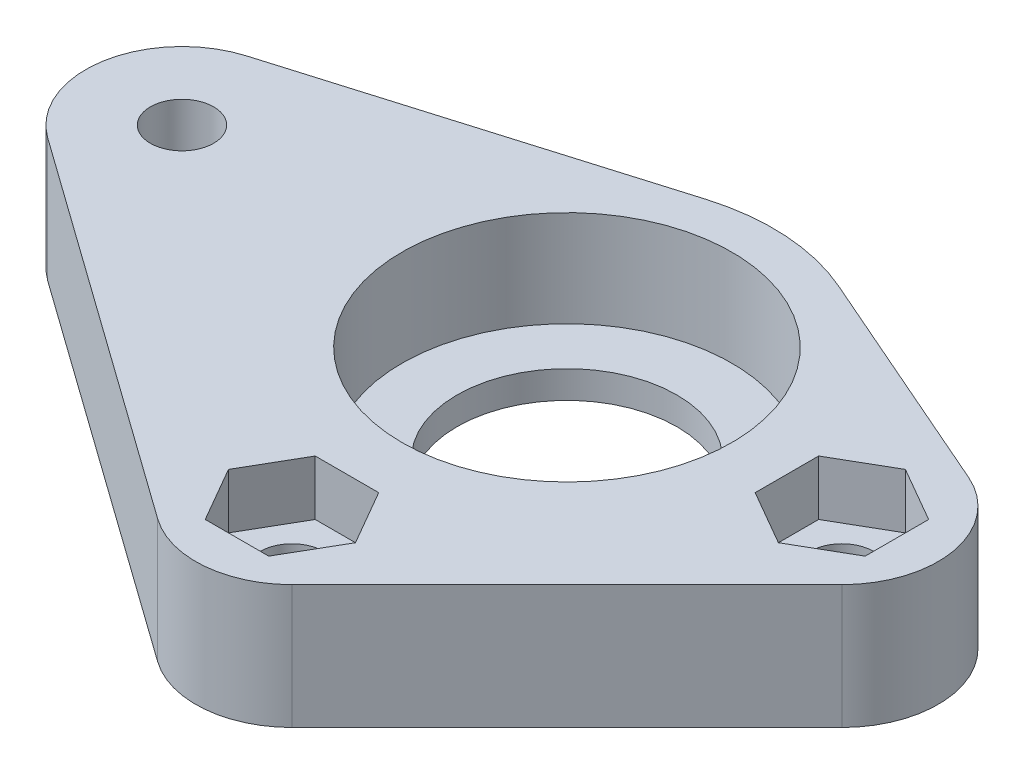
ISO-10303-21;
HEADER;
FILE_DESCRIPTION(('STEP AP214'),'2;1');
FILE_NAME('part.step','',(''),(''),'','','');
FILE_SCHEMA(('AUTOMOTIVE_DESIGN { 1 0 10303 214 1 1 1 1 }'));
ENDSEC;
DATA;
#1=APPLICATION_CONTEXT('core data for automotive mechanical design processes');
#2=APPLICATION_PROTOCOL_DEFINITION('international standard','automotive_design',2000,#1);
#3=PRODUCT_CONTEXT('',#1,'mechanical');
#4=PRODUCT('Part','Part','',(#3));
#5=PRODUCT_RELATED_PRODUCT_CATEGORY('part','',(#4));
#6=PRODUCT_DEFINITION_FORMATION('','',#4);
#7=PRODUCT_DEFINITION_CONTEXT('part definition',#1,'design');
#8=PRODUCT_DEFINITION('design','',#6,#7);
#9=PRODUCT_DEFINITION_SHAPE('','',#8);
#10=(LENGTH_UNIT() NAMED_UNIT(*) SI_UNIT(.MILLI.,.METRE.));
#11=(NAMED_UNIT(*) PLANE_ANGLE_UNIT() SI_UNIT($,.RADIAN.));
#12=(NAMED_UNIT(*) SI_UNIT($,.STERADIAN.) SOLID_ANGLE_UNIT());
#13=UNCERTAINTY_MEASURE_WITH_UNIT(LENGTH_MEASURE(1.E-05),#10,'distance_accuracy_value','');
#14=(GEOMETRIC_REPRESENTATION_CONTEXT(3) GLOBAL_UNCERTAINTY_ASSIGNED_CONTEXT((#13)) GLOBAL_UNIT_ASSIGNED_CONTEXT((#10,
#11,#12)) REPRESENTATION_CONTEXT('',''));
#15=CARTESIAN_POINT('',(0.,0.,0.));
#16=DIRECTION('',(0.,0.,1.));
#17=DIRECTION('',(1.,0.,0.));
#18=AXIS2_PLACEMENT_3D('',#15,#16,#17);
#19=CARTESIAN_POINT('',(-14.,4.5,0.));
#20=DIRECTION('',(0.,-1.,0.));
#21=DIRECTION('',(0.,0.,-1.));
#22=AXIS2_PLACEMENT_3D('',#19,#20,#21);
#23=CYLINDRICAL_SURFACE('',#22,1.15);
#24=CARTESIAN_POINT('',(-14.,4.5,0.));
#25=DIRECTION('',(0.,1.,0.));
#26=DIRECTION('',(0.,0.,1.));
#27=AXIS2_PLACEMENT_3D('',#24,#25,#26);
#28=CIRCLE('',#27,1.15);
#29=CARTESIAN_POINT('',(-14.,4.5,1.15));
#30=VERTEX_POINT('',#29);
#31=EDGE_CURVE('E372',#30,#30,#28,.T.);
#32=ORIENTED_EDGE('',*,*,#31,.T.);
#33=EDGE_LOOP('',(#32));
#34=FACE_BOUND('',#33,.T.);
#35=CARTESIAN_POINT('',(-14.,2.,0.));
#36=DIRECTION('',(0.,-1.,0.));
#37=DIRECTION('',(0.,0.,-1.));
#38=AXIS2_PLACEMENT_3D('',#35,#36,#37);
#39=CIRCLE('',#38,1.15);
#40=CARTESIAN_POINT('',(-14.,2.,-1.15));
#41=VERTEX_POINT('',#40);
#42=EDGE_CURVE('E38',#41,#41,#39,.T.);
#43=ORIENTED_EDGE('',*,*,#42,.T.);
#44=EDGE_LOOP('',(#43));
#45=FACE_BOUND('',#44,.T.);
#46=ADVANCED_FACE('F34',(#34,#45),#23,.F.);
#47=CARTESIAN_POINT('',(10.,4.5,0.));
#48=DIRECTION('',(0.,-1.,0.));
#49=DIRECTION('',(0.,0.,-1.));
#50=AXIS2_PLACEMENT_3D('',#47,#48,#49);
#51=CYLINDRICAL_SURFACE('',#50,1.15);
#52=CARTESIAN_POINT('',(10.,0.,0.));
#53=DIRECTION('',(0.,1.,0.));
#54=DIRECTION('',(0.,0.,1.));
#55=AXIS2_PLACEMENT_3D('',#52,#53,#54);
#56=CIRCLE('',#55,1.15);
#57=CARTESIAN_POINT('',(10.,0.,1.15));
#58=VERTEX_POINT('',#57);
#59=EDGE_CURVE('E369',#58,#58,#56,.T.);
#60=ORIENTED_EDGE('',*,*,#59,.F.);
#61=EDGE_LOOP('',(#60));
#62=FACE_BOUND('',#61,.T.);
#63=CARTESIAN_POINT('',(10.,2.5,0.));
#64=DIRECTION('',(0.,1.,0.));
#65=DIRECTION('',(0.,0.,1.));
#66=AXIS2_PLACEMENT_3D('',#63,#64,#65);
#67=CIRCLE('',#66,1.15);
#68=CARTESIAN_POINT('',(10.,2.5,1.15));
#69=VERTEX_POINT('',#68);
#70=EDGE_CURVE('E365',#69,#69,#67,.T.);
#71=ORIENTED_EDGE('',*,*,#70,.T.);
#72=EDGE_LOOP('',(#71));
#73=FACE_BOUND('',#72,.T.);
#74=ADVANCED_FACE('F438',(#62,#73),#51,.F.);
#75=CARTESIAN_POINT('',(0.,4.5,10.));
#76=DIRECTION('',(0.,-1.,0.));
#77=DIRECTION('',(0.,0.,-1.));
#78=AXIS2_PLACEMENT_3D('',#75,#76,#77);
#79=CYLINDRICAL_SURFACE('',#78,1.15);
#80=CARTESIAN_POINT('',(0.,0.,10.));
#81=DIRECTION('',(0.,1.,0.));
#82=DIRECTION('',(0.,0.,1.));
#83=AXIS2_PLACEMENT_3D('',#80,#81,#82);
#84=CIRCLE('',#83,1.15);
#85=CARTESIAN_POINT('',(0.,0.,11.15));
#86=VERTEX_POINT('',#85);
#87=EDGE_CURVE('E366',#86,#86,#84,.T.);
#88=ORIENTED_EDGE('',*,*,#87,.F.);
#89=EDGE_LOOP('',(#88));
#90=FACE_BOUND('',#89,.T.);
#91=CARTESIAN_POINT('',(0.,2.5,10.));
#92=DIRECTION('',(0.,1.,0.));
#93=DIRECTION('',(0.,0.,1.));
#94=AXIS2_PLACEMENT_3D('',#91,#92,#93);
#95=CIRCLE('',#94,1.15);
#96=CARTESIAN_POINT('',(0.,2.5,11.15));
#97=VERTEX_POINT('',#96);
#98=EDGE_CURVE('E301',#97,#97,#95,.T.);
#99=ORIENTED_EDGE('',*,*,#98,.T.);
#100=EDGE_LOOP('',(#99));
#101=FACE_BOUND('',#100,.T.);
#102=ADVANCED_FACE('F564',(#90,#101),#79,.F.);
#103=CARTESIAN_POINT('',(0.,4.5,0.));
#104=DIRECTION('',(0.,-1.,0.));
#105=DIRECTION('',(0.,0.,-1.));
#106=AXIS2_PLACEMENT_3D('',#103,#104,#105);
#107=CYLINDRICAL_SURFACE('',#106,4.);
#108=CARTESIAN_POINT('',(0.,0.,0.));
#109=DIRECTION('',(0.,1.,0.));
#110=DIRECTION('',(0.,0.,1.));
#111=AXIS2_PLACEMENT_3D('',#108,#109,#110);
#112=CIRCLE('',#111,4.);
#113=CARTESIAN_POINT('',(0.,0.,4.));
#114=VERTEX_POINT('',#113);
#115=EDGE_CURVE('E375',#114,#114,#112,.T.);
#116=ORIENTED_EDGE('',*,*,#115,.F.);
#117=EDGE_LOOP('',(#116));
#118=FACE_BOUND('',#117,.T.);
#119=CARTESIAN_POINT('',(0.,1.,0.));
#120=DIRECTION('',(0.,1.,0.));
#121=DIRECTION('',(0.,0.,1.));
#122=AXIS2_PLACEMENT_3D('',#119,#120,#121);
#123=CIRCLE('',#122,4.);
#124=CARTESIAN_POINT('',(0.,1.,4.));
#125=VERTEX_POINT('',#124);
#126=EDGE_CURVE('E361',#125,#125,#123,.T.);
#127=ORIENTED_EDGE('',*,*,#126,.T.);
#128=EDGE_LOOP('',(#127));
#129=FACE_BOUND('',#128,.T.);
#130=ADVANCED_FACE('F471',(#118,#129),#107,.F.);
#131=CARTESIAN_POINT('',(0.,4.5,0.));
#132=DIRECTION('',(0.,-1.,0.));
#133=DIRECTION('',(0.,0.,-1.));
#134=AXIS2_PLACEMENT_3D('',#131,#132,#133);
#135=PLANE('',#134);
#136=DIRECTION('',(0.,0.,-1.));
#137=VECTOR('',#136,1.);
#138=CARTESIAN_POINT('',(12.,4.5,1.15470053837925));
#139=LINE('',#138,#137);
#140=CARTESIAN_POINT('',(12.,4.5,1.15470053837925));
#141=VERTEX_POINT('',#140);
#142=CARTESIAN_POINT('',(12.,4.5,-1.15470053837925));
#143=VERTEX_POINT('',#142);
#144=EDGE_CURVE('E284',#141,#143,#139,.T.);
#145=ORIENTED_EDGE('',*,*,#144,.F.);
#146=DIRECTION('',(0.866025403784439,0.,-0.5));
#147=VECTOR('',#146,1.);
#148=CARTESIAN_POINT('',(10.,4.5,2.3094010767585));
#149=LINE('',#148,#147);
#150=CARTESIAN_POINT('',(10.,4.5,2.3094010767585));
#151=VERTEX_POINT('',#150);
#152=EDGE_CURVE('E59',#151,#141,#149,.T.);
#153=ORIENTED_EDGE('',*,*,#152,.F.);
#154=DIRECTION('',(0.866025403784438,0.,0.5));
#155=VECTOR('',#154,1.);
#156=CARTESIAN_POINT('',(8.,4.5,1.15470053837925));
#157=LINE('',#156,#155);
#158=CARTESIAN_POINT('',(8.,4.5,1.15470053837925));
#159=VERTEX_POINT('',#158);
#160=EDGE_CURVE('E267',#159,#151,#157,.T.);
#161=ORIENTED_EDGE('',*,*,#160,.F.);
#162=DIRECTION('',(0.,0.,1.));
#163=VECTOR('',#162,1.);
#164=CARTESIAN_POINT('',(8.,4.5,-1.15470053837925));
#165=LINE('',#164,#163);
#166=CARTESIAN_POINT('',(8.,4.5,-1.15470053837925));
#167=VERTEX_POINT('',#166);
#168=EDGE_CURVE('E294',#167,#159,#165,.T.);
#169=ORIENTED_EDGE('',*,*,#168,.F.);
#170=DIRECTION('',(-0.866025403784439,0.,0.5));
#171=VECTOR('',#170,1.);
#172=CARTESIAN_POINT('',(10.,4.5,-2.3094010767585));
#173=LINE('',#172,#171);
#174=CARTESIAN_POINT('',(10.,4.5,-2.3094010767585));
#175=VERTEX_POINT('',#174);
#176=EDGE_CURVE('E291',#175,#167,#173,.T.);
#177=ORIENTED_EDGE('',*,*,#176,.F.);
#178=DIRECTION('',(-0.866025403784439,0.,-0.5));
#179=VECTOR('',#178,1.);
#180=CARTESIAN_POINT('',(12.,4.5,-1.15470053837925));
#181=LINE('',#180,#179);
#182=EDGE_CURVE('E288',#143,#175,#181,.T.);
#183=ORIENTED_EDGE('',*,*,#182,.F.);
#184=EDGE_LOOP('',(#145,#153,#161,#169,#177,#183));
#185=FACE_BOUND('',#184,.T.);
#186=DIRECTION('',(-0.5,0.,-0.866025403784439));
#187=VECTOR('',#186,1.);
#188=CARTESIAN_POINT('',(2.3094010767585,4.5,10.));
#189=LINE('',#188,#187);
#190=CARTESIAN_POINT('',(2.3094010767585,4.5,10.));
#191=VERTEX_POINT('',#190);
#192=CARTESIAN_POINT('',(1.15470053837925,4.5,8.));
#193=VERTEX_POINT('',#192);
#194=EDGE_CURVE('E333',#191,#193,#189,.T.);
#195=ORIENTED_EDGE('',*,*,#194,.F.);
#196=DIRECTION('',(0.5,0.,-0.866025403784439));
#197=VECTOR('',#196,1.);
#198=CARTESIAN_POINT('',(1.15470053837925,4.5,12.));
#199=LINE('',#198,#197);
#200=CARTESIAN_POINT('',(1.15470053837925,4.5,12.));
#201=VERTEX_POINT('',#200);
#202=EDGE_CURVE('E331',#201,#191,#199,.T.);
#203=ORIENTED_EDGE('',*,*,#202,.F.);
#204=DIRECTION('',(1.,0.,0.));
#205=VECTOR('',#204,1.);
#206=CARTESIAN_POINT('',(-1.15470053837925,4.5,12.));
#207=LINE('',#206,#205);
#208=CARTESIAN_POINT('',(-1.15470053837925,4.5,12.));
#209=VERTEX_POINT('',#208);
#210=EDGE_CURVE('E315',#209,#201,#207,.T.);
#211=ORIENTED_EDGE('',*,*,#210,.F.);
#212=DIRECTION('',(0.5,0.,0.866025403784439));
#213=VECTOR('',#212,1.);
#214=CARTESIAN_POINT('',(-2.30940107675851,4.5,10.));
#215=LINE('',#214,#213);
#216=CARTESIAN_POINT('',(-2.30940107675851,4.5,10.));
#217=VERTEX_POINT('',#216);
#218=EDGE_CURVE('E342',#217,#209,#215,.T.);
#219=ORIENTED_EDGE('',*,*,#218,.F.);
#220=DIRECTION('',(-0.5,0.,0.866025403784439));
#221=VECTOR('',#220,1.);
#222=CARTESIAN_POINT('',(-1.15470053837925,4.5,8.));
#223=LINE('',#222,#221);
#224=CARTESIAN_POINT('',(-1.15470053837925,4.5,8.));
#225=VERTEX_POINT('',#224);
#226=EDGE_CURVE('E339',#225,#217,#223,.T.);
#227=ORIENTED_EDGE('',*,*,#226,.F.);
#228=DIRECTION('',(-1.,0.,0.));
#229=VECTOR('',#228,1.);
#230=CARTESIAN_POINT('',(1.15470053837925,4.5,8.));
#231=LINE('',#230,#229);
#232=EDGE_CURVE('E336',#193,#225,#231,.T.);
#233=ORIENTED_EDGE('',*,*,#232,.F.);
#234=EDGE_LOOP('',(#195,#203,#211,#219,#227,#233));
#235=FACE_BOUND('',#234,.T.);
#236=CARTESIAN_POINT('',(0.,4.5,0.));
#237=DIRECTION('',(0.,1.,0.));
#238=DIRECTION('',(0.,0.,1.));
#239=AXIS2_PLACEMENT_3D('',#236,#237,#238);
#240=CIRCLE('',#239,6.);
#241=CARTESIAN_POINT('',(0.,4.5,6.));
#242=VERTEX_POINT('',#241);
#243=EDGE_CURVE('E362',#242,#242,#240,.T.);
#244=ORIENTED_EDGE('',*,*,#243,.F.);
#245=EDGE_LOOP('',(#244));
#246=FACE_BOUND('',#245,.T.);
#247=CARTESIAN_POINT('',(0.,4.5,0.));
#248=DIRECTION('',(0.,1.,0.));
#249=DIRECTION('',(0.,0.,-1.));
#250=AXIS2_PLACEMENT_3D('',#247,#248,#249);
#251=CIRCLE('',#250,7.5);
#252=CARTESIAN_POINT('',(3.,4.5,-6.87386354243376));
#253=VERTEX_POINT('',#252);
#254=CARTESIAN_POINT('',(-2.14285714285714,4.5,-7.18736135624932));
#255=VERTEX_POINT('',#254);
#256=EDGE_CURVE('E379',#253,#255,#251,.T.);
#257=ORIENTED_EDGE('',*,*,#256,.T.);
#258=DIRECTION('',(-0.95831484749991,0.,0.285714285714286));
#259=VECTOR('',#258,1.);
#260=CARTESIAN_POINT('',(-15.,4.5,-3.35410196624968));
#261=LINE('',#260,#259);
#262=CARTESIAN_POINT('',(-15.,4.5,-3.35410196624969));
#263=VERTEX_POINT('',#262);
#264=EDGE_CURVE('E382',#255,#263,#261,.T.);
#265=ORIENTED_EDGE('',*,*,#264,.T.);
#266=CARTESIAN_POINT('',(-14.,4.5,0.));
#267=DIRECTION('',(0.,1.,0.));
#268=DIRECTION('',(0.,0.,1.));
#269=AXIS2_PLACEMENT_3D('',#266,#267,#268);
#270=CIRCLE('',#269,3.5);
#271=CARTESIAN_POINT('',(-16.0343336780168,4.5,2.84806714922357));
#272=VERTEX_POINT('',#271);
#273=EDGE_CURVE('E385',#263,#272,#270,.T.);
#274=ORIENTED_EDGE('',*,*,#273,.T.);
#275=DIRECTION('',(0.813733471206735,0.,0.581238193719096));
#276=VECTOR('',#275,1.);
#277=CARTESIAN_POINT('',(-2.03433367801684,4.5,12.8480671492236));
#278=LINE('',#277,#276);
#279=CARTESIAN_POINT('',(-2.03433367801684,4.5,12.8480671492236));
#280=VERTEX_POINT('',#279);
#281=EDGE_CURVE('E387',#272,#280,#278,.T.);
#282=ORIENTED_EDGE('',*,*,#281,.T.);
#283=CARTESIAN_POINT('',(0.,4.5,10.));
#284=DIRECTION('',(0.,1.,0.));
#285=DIRECTION('',(0.,0.,-1.));
#286=AXIS2_PLACEMENT_3D('',#283,#284,#285);
#287=CIRCLE('',#286,3.5);
#288=CARTESIAN_POINT('',(2.47487373415291,4.5,12.4748737341529));
#289=VERTEX_POINT('',#288);
#290=EDGE_CURVE('E389',#280,#289,#287,.T.);
#291=ORIENTED_EDGE('',*,*,#290,.T.);
#292=DIRECTION('',(0.707106781186548,0.,-0.707106781186547));
#293=VECTOR('',#292,1.);
#294=CARTESIAN_POINT('',(12.4748737341529,4.5,2.47487373415292));
#295=LINE('',#294,#293);
#296=CARTESIAN_POINT('',(12.4748737341529,4.5,2.47487373415292));
#297=VERTEX_POINT('',#296);
#298=EDGE_CURVE('E391',#289,#297,#295,.T.);
#299=ORIENTED_EDGE('',*,*,#298,.T.);
#300=CARTESIAN_POINT('',(10.,4.5,0.));
#301=DIRECTION('',(0.,1.,0.));
#302=DIRECTION('',(0.,0.,-1.));
#303=AXIS2_PLACEMENT_3D('',#300,#301,#302);
#304=CIRCLE('',#303,3.5);
#305=CARTESIAN_POINT('',(11.4,4.5,-3.20780298646909));
#306=VERTEX_POINT('',#305);
#307=EDGE_CURVE('E393',#297,#306,#304,.T.);
#308=ORIENTED_EDGE('',*,*,#307,.T.);
#309=DIRECTION('',(-0.916515138991168,0.,-0.4));
#310=VECTOR('',#309,1.);
#311=CARTESIAN_POINT('',(3.,4.5,-6.87386354243376));
#312=LINE('',#311,#310);
#313=EDGE_CURVE('E395',#306,#253,#312,.T.);
#314=ORIENTED_EDGE('',*,*,#313,.T.);
#315=EDGE_LOOP('',(#257,#265,#274,#282,#291,#299,#308,#314));
#316=FACE_BOUND('',#315,.T.);
#317=ORIENTED_EDGE('',*,*,#31,.F.);
#318=EDGE_LOOP('',(#317));
#319=FACE_BOUND('',#318,.T.);
#320=ADVANCED_FACE('F467',(#185,#235,#246,#316,#319),#135,.F.);
#321=CARTESIAN_POINT('',(0.,0.,0.));
#322=DIRECTION('',(0.,-1.,0.));
#323=DIRECTION('',(0.,0.,-1.));
#324=AXIS2_PLACEMENT_3D('',#321,#322,#323);
#325=PLANE('',#324);
#326=DIRECTION('',(0.866025403784439,0.,0.5));
#327=VECTOR('',#326,1.);
#328=CARTESIAN_POINT('',(-14.,0.,-2.3094010767585));
#329=LINE('',#328,#327);
#330=CARTESIAN_POINT('',(-14.,0.,-2.3094010767585));
#331=VERTEX_POINT('',#330);
#332=CARTESIAN_POINT('',(-12.,0.,-1.15470053837925));
#333=VERTEX_POINT('',#332);
#334=EDGE_CURVE('E51',#331,#333,#329,.T.);
#335=ORIENTED_EDGE('',*,*,#334,.F.);
#336=DIRECTION('',(0.866025403784439,0.,-0.5));
#337=VECTOR('',#336,1.);
#338=CARTESIAN_POINT('',(-16.,0.,-1.15470053837925));
#339=LINE('',#338,#337);
#340=CARTESIAN_POINT('',(-16.,0.,-1.15470053837925));
#341=VERTEX_POINT('',#340);
#342=EDGE_CURVE('E230',#341,#331,#339,.T.);
#343=ORIENTED_EDGE('',*,*,#342,.F.);
#344=DIRECTION('',(0.,0.,-1.));
#345=VECTOR('',#344,1.);
#346=CARTESIAN_POINT('',(-16.,0.,1.15470053837925));
#347=LINE('',#346,#345);
#348=CARTESIAN_POINT('',(-16.,0.,1.15470053837925));
#349=VERTEX_POINT('',#348);
#350=EDGE_CURVE('E233',#349,#341,#347,.T.);
#351=ORIENTED_EDGE('',*,*,#350,.F.);
#352=DIRECTION('',(-0.866025403784439,0.,-0.5));
#353=VECTOR('',#352,1.);
#354=CARTESIAN_POINT('',(-14.,0.,2.3094010767585));
#355=LINE('',#354,#353);
#356=CARTESIAN_POINT('',(-14.,0.,2.3094010767585));
#357=VERTEX_POINT('',#356);
#358=EDGE_CURVE('E249',#357,#349,#355,.T.);
#359=ORIENTED_EDGE('',*,*,#358,.F.);
#360=DIRECTION('',(-0.866025403784439,0.,0.5));
#361=VECTOR('',#360,1.);
#362=CARTESIAN_POINT('',(-12.,0.,1.15470053837925));
#363=LINE('',#362,#361);
#364=CARTESIAN_POINT('',(-12.,0.,1.15470053837925));
#365=VERTEX_POINT('',#364);
#366=EDGE_CURVE('E246',#365,#357,#363,.T.);
#367=ORIENTED_EDGE('',*,*,#366,.F.);
#368=DIRECTION('',(0.,0.,1.));
#369=VECTOR('',#368,1.);
#370=CARTESIAN_POINT('',(-12.,0.,-1.15470053837925));
#371=LINE('',#370,#369);
#372=EDGE_CURVE('E244',#333,#365,#371,.T.);
#373=ORIENTED_EDGE('',*,*,#372,.F.);
#374=EDGE_LOOP('',(#335,#343,#351,#359,#367,#373));
#375=FACE_BOUND('',#374,.T.);
#376=ORIENTED_EDGE('',*,*,#59,.T.);
#377=EDGE_LOOP('',(#376));
#378=FACE_BOUND('',#377,.T.);
#379=ORIENTED_EDGE('',*,*,#115,.T.);
#380=EDGE_LOOP('',(#379));
#381=FACE_BOUND('',#380,.T.);
#382=CARTESIAN_POINT('',(0.,0.,0.));
#383=DIRECTION('',(0.,1.,0.));
#384=DIRECTION('',(0.,0.,-1.));
#385=AXIS2_PLACEMENT_3D('',#382,#383,#384);
#386=CIRCLE('',#385,7.5);
#387=CARTESIAN_POINT('',(3.,0.,-6.87386354243376));
#388=VERTEX_POINT('',#387);
#389=CARTESIAN_POINT('',(-2.14285714285714,0.,-7.18736135624932));
#390=VERTEX_POINT('',#389);
#391=EDGE_CURVE('E378',#388,#390,#386,.T.);
#392=ORIENTED_EDGE('',*,*,#391,.F.);
#393=DIRECTION('',(-0.916515138991168,0.,-0.4));
#394=VECTOR('',#393,1.);
#395=CARTESIAN_POINT('',(3.,0.,-6.87386354243376));
#396=LINE('',#395,#394);
#397=CARTESIAN_POINT('',(11.4,0.,-3.20780298646909));
#398=VERTEX_POINT('',#397);
#399=EDGE_CURVE('E383',#398,#388,#396,.T.);
#400=ORIENTED_EDGE('',*,*,#399,.F.);
#401=CARTESIAN_POINT('',(10.,0.,0.));
#402=DIRECTION('',(0.,1.,0.));
#403=DIRECTION('',(0.,0.,-1.));
#404=AXIS2_PLACEMENT_3D('',#401,#402,#403);
#405=CIRCLE('',#404,3.5);
#406=CARTESIAN_POINT('',(12.4748737341529,0.,2.47487373415292));
#407=VERTEX_POINT('',#406);
#408=EDGE_CURVE('E410',#407,#398,#405,.T.);
#409=ORIENTED_EDGE('',*,*,#408,.F.);
#410=DIRECTION('',(0.707106781186548,0.,-0.707106781186547));
#411=VECTOR('',#410,1.);
#412=CARTESIAN_POINT('',(12.4748737341529,0.,2.47487373415292));
#413=LINE('',#412,#411);
#414=CARTESIAN_POINT('',(2.47487373415291,0.,12.4748737341529));
#415=VERTEX_POINT('',#414);
#416=EDGE_CURVE('E408',#415,#407,#413,.T.);
#417=ORIENTED_EDGE('',*,*,#416,.F.);
#418=CARTESIAN_POINT('',(0.,0.,10.));
#419=DIRECTION('',(0.,1.,0.));
#420=DIRECTION('',(0.,0.,-1.));
#421=AXIS2_PLACEMENT_3D('',#418,#419,#420);
#422=CIRCLE('',#421,3.5);
#423=CARTESIAN_POINT('',(-2.03433367801684,0.,12.8480671492236));
#424=VERTEX_POINT('',#423);
#425=EDGE_CURVE('E406',#424,#415,#422,.T.);
#426=ORIENTED_EDGE('',*,*,#425,.F.);
#427=DIRECTION('',(0.813733471206735,0.,0.581238193719096));
#428=VECTOR('',#427,1.);
#429=CARTESIAN_POINT('',(-2.03433367801684,0.,12.8480671492236));
#430=LINE('',#429,#428);
#431=CARTESIAN_POINT('',(-16.0343336780168,0.,2.84806714922357));
#432=VERTEX_POINT('',#431);
#433=EDGE_CURVE('E404',#432,#424,#430,.T.);
#434=ORIENTED_EDGE('',*,*,#433,.F.);
#435=CARTESIAN_POINT('',(-14.,0.,0.));
#436=DIRECTION('',(0.,1.,0.));
#437=DIRECTION('',(0.,0.,1.));
#438=AXIS2_PLACEMENT_3D('',#435,#436,#437);
#439=CIRCLE('',#438,3.5);
#440=CARTESIAN_POINT('',(-15.,0.,-3.35410196624969));
#441=VERTEX_POINT('',#440);
#442=EDGE_CURVE('E402',#441,#432,#439,.T.);
#443=ORIENTED_EDGE('',*,*,#442,.F.);
#444=DIRECTION('',(-0.95831484749991,0.,0.285714285714286));
#445=VECTOR('',#444,1.);
#446=CARTESIAN_POINT('',(-15.,0.,-3.35410196624968));
#447=LINE('',#446,#445);
#448=EDGE_CURVE('E400',#390,#441,#447,.T.);
#449=ORIENTED_EDGE('',*,*,#448,.F.);
#450=EDGE_LOOP('',(#392,#400,#409,#417,#426,#434,#443,#449));
#451=FACE_BOUND('',#450,.T.);
#452=ORIENTED_EDGE('',*,*,#87,.T.);
#453=EDGE_LOOP('',(#452));
#454=FACE_BOUND('',#453,.T.);
#455=ADVANCED_FACE('F470',(#375,#378,#381,#451,#454),#325,.T.);
#456=CARTESIAN_POINT('',(0.,4.5,0.));
#457=DIRECTION('',(0.,-1.,0.));
#458=DIRECTION('',(0.,0.,-1.));
#459=AXIS2_PLACEMENT_3D('',#456,#457,#458);
#460=CYLINDRICAL_SURFACE('',#459,7.5);
#461=ORIENTED_EDGE('',*,*,#391,.T.);
#462=DIRECTION('',(0.,-1.,0.));
#463=VECTOR('',#462,1.);
#464=CARTESIAN_POINT('',(-2.14285714285714,4.5,-7.18736135624932));
#465=LINE('',#464,#463);
#466=EDGE_CURVE('E11',#255,#390,#465,.T.);
#467=ORIENTED_EDGE('',*,*,#466,.F.);
#468=ORIENTED_EDGE('',*,*,#256,.F.);
#469=DIRECTION('',(0.,-1.,0.));
#470=VECTOR('',#469,1.);
#471=CARTESIAN_POINT('',(3.,4.5,-6.87386354243376));
#472=LINE('',#471,#470);
#473=EDGE_CURVE('E397',#253,#388,#472,.T.);
#474=ORIENTED_EDGE('',*,*,#473,.T.);
#475=EDGE_LOOP('',(#461,#467,#468,#474));
#476=FACE_BOUND('',#475,.T.);
#477=ADVANCED_FACE('F36',(#476),#460,.T.);
#478=CARTESIAN_POINT('',(-15.,4.5,-3.35410196624968));
#479=DIRECTION('',(0.285714285714286,0.,0.95831484749991));
#480=DIRECTION('',(0.95831484749991,0.,-0.285714285714286));
#481=AXIS2_PLACEMENT_3D('',#478,#479,#480);
#482=PLANE('',#481);
#483=ORIENTED_EDGE('',*,*,#448,.T.);
#484=DIRECTION('',(0.,-1.,0.));
#485=VECTOR('',#484,1.);
#486=CARTESIAN_POINT('',(-15.,4.5,-3.35410196624969));
#487=LINE('',#486,#485);
#488=EDGE_CURVE('E43',#263,#441,#487,.T.);
#489=ORIENTED_EDGE('',*,*,#488,.F.);
#490=ORIENTED_EDGE('',*,*,#264,.F.);
#491=ORIENTED_EDGE('',*,*,#466,.T.);
#492=EDGE_LOOP('',(#483,#489,#490,#491));
#493=FACE_BOUND('',#492,.T.);
#494=ADVANCED_FACE('F598',(#493),#482,.F.);
#495=CARTESIAN_POINT('',(-14.,4.5,0.));
#496=DIRECTION('',(0.,-1.,0.));
#497=DIRECTION('',(0.,0.,-1.));
#498=AXIS2_PLACEMENT_3D('',#495,#496,#497);
#499=CYLINDRICAL_SURFACE('',#498,3.5);
#500=ORIENTED_EDGE('',*,*,#442,.T.);
#501=DIRECTION('',(0.,-1.,0.));
#502=VECTOR('',#501,1.);
#503=CARTESIAN_POINT('',(-16.0343336780168,4.5,2.84806714922357));
#504=LINE('',#503,#502);
#505=EDGE_CURVE('E427',#272,#432,#504,.T.);
#506=ORIENTED_EDGE('',*,*,#505,.F.);
#507=ORIENTED_EDGE('',*,*,#273,.F.);
#508=ORIENTED_EDGE('',*,*,#488,.T.);
#509=EDGE_LOOP('',(#500,#506,#507,#508));
#510=FACE_BOUND('',#509,.T.);
#511=ADVANCED_FACE('F595',(#510),#499,.T.);
#512=CARTESIAN_POINT('',(-2.03433367801684,4.5,12.8480671492236));
#513=DIRECTION('',(0.581238193719096,0.,-0.813733471206735));
#514=DIRECTION('',(-0.813733471206735,0.,-0.581238193719096));
#515=AXIS2_PLACEMENT_3D('',#512,#513,#514);
#516=PLANE('',#515);
#517=ORIENTED_EDGE('',*,*,#433,.T.);
#518=DIRECTION('',(0.,-1.,0.));
#519=VECTOR('',#518,1.);
#520=CARTESIAN_POINT('',(-2.03433367801684,4.5,12.8480671492236));
#521=LINE('',#520,#519);
#522=EDGE_CURVE('E424',#280,#424,#521,.T.);
#523=ORIENTED_EDGE('',*,*,#522,.F.);
#524=ORIENTED_EDGE('',*,*,#281,.F.);
#525=ORIENTED_EDGE('',*,*,#505,.T.);
#526=EDGE_LOOP('',(#517,#523,#524,#525));
#527=FACE_BOUND('',#526,.T.);
#528=ADVANCED_FACE('F591',(#527),#516,.F.);
#529=CARTESIAN_POINT('',(0.,4.5,10.));
#530=DIRECTION('',(0.,-1.,0.));
#531=DIRECTION('',(0.,0.,-1.));
#532=AXIS2_PLACEMENT_3D('',#529,#530,#531);
#533=CYLINDRICAL_SURFACE('',#532,3.5);
#534=ORIENTED_EDGE('',*,*,#425,.T.);
#535=DIRECTION('',(0.,-1.,0.));
#536=VECTOR('',#535,1.);
#537=CARTESIAN_POINT('',(2.47487373415291,4.5,12.4748737341529));
#538=LINE('',#537,#536);
#539=EDGE_CURVE('E421',#289,#415,#538,.T.);
#540=ORIENTED_EDGE('',*,*,#539,.F.);
#541=ORIENTED_EDGE('',*,*,#290,.F.);
#542=ORIENTED_EDGE('',*,*,#522,.T.);
#543=EDGE_LOOP('',(#534,#540,#541,#542));
#544=FACE_BOUND('',#543,.T.);
#545=ADVANCED_FACE('F587',(#544),#533,.T.);
#546=CARTESIAN_POINT('',(12.4748737341529,4.5,2.47487373415292));
#547=DIRECTION('',(-0.707106781186547,0.,-0.707106781186548));
#548=DIRECTION('',(-0.707106781186548,0.,0.707106781186547));
#549=AXIS2_PLACEMENT_3D('',#546,#547,#548);
#550=PLANE('',#549);
#551=ORIENTED_EDGE('',*,*,#416,.T.);
#552=DIRECTION('',(0.,-1.,0.));
#553=VECTOR('',#552,1.);
#554=CARTESIAN_POINT('',(12.4748737341529,4.5,2.47487373415292));
#555=LINE('',#554,#553);
#556=EDGE_CURVE('E418',#297,#407,#555,.T.);
#557=ORIENTED_EDGE('',*,*,#556,.F.);
#558=ORIENTED_EDGE('',*,*,#298,.F.);
#559=ORIENTED_EDGE('',*,*,#539,.T.);
#560=EDGE_LOOP('',(#551,#557,#558,#559));
#561=FACE_BOUND('',#560,.T.);
#562=ADVANCED_FACE('F583',(#561),#550,.F.);
#563=CARTESIAN_POINT('',(10.,4.5,0.));
#564=DIRECTION('',(0.,-1.,0.));
#565=DIRECTION('',(0.,0.,-1.));
#566=AXIS2_PLACEMENT_3D('',#563,#564,#565);
#567=CYLINDRICAL_SURFACE('',#566,3.5);
#568=ORIENTED_EDGE('',*,*,#408,.T.);
#569=DIRECTION('',(0.,-1.,0.));
#570=VECTOR('',#569,1.);
#571=CARTESIAN_POINT('',(11.4,4.5,-3.20780298646909));
#572=LINE('',#571,#570);
#573=EDGE_CURVE('E415',#306,#398,#572,.T.);
#574=ORIENTED_EDGE('',*,*,#573,.F.);
#575=ORIENTED_EDGE('',*,*,#307,.F.);
#576=ORIENTED_EDGE('',*,*,#556,.T.);
#577=EDGE_LOOP('',(#568,#574,#575,#576));
#578=FACE_BOUND('',#577,.T.);
#579=ADVANCED_FACE('F579',(#578),#567,.T.);
#580=CARTESIAN_POINT('',(3.,4.5,-6.87386354243376));
#581=DIRECTION('',(-0.4,0.,0.916515138991168));
#582=DIRECTION('',(0.916515138991168,0.,0.4));
#583=AXIS2_PLACEMENT_3D('',#580,#581,#582);
#584=PLANE('',#583);
#585=ORIENTED_EDGE('',*,*,#399,.T.);
#586=ORIENTED_EDGE('',*,*,#473,.F.);
#587=ORIENTED_EDGE('',*,*,#313,.F.);
#588=ORIENTED_EDGE('',*,*,#573,.T.);
#589=EDGE_LOOP('',(#585,#586,#587,#588));
#590=FACE_BOUND('',#589,.T.);
#591=ADVANCED_FACE('F562',(#590),#584,.F.);
#592=CARTESIAN_POINT('',(0.,1.,0.));
#593=DIRECTION('',(0.,1.,0.));
#594=DIRECTION('',(0.,0.,1.));
#595=AXIS2_PLACEMENT_3D('',#592,#593,#594);
#596=CYLINDRICAL_SURFACE('',#595,6.);
#597=CARTESIAN_POINT('',(0.,1.,0.));
#598=DIRECTION('',(0.,1.,0.));
#599=DIRECTION('',(0.,0.,1.));
#600=AXIS2_PLACEMENT_3D('',#597,#598,#599);
#601=CIRCLE('',#600,6.);
#602=CARTESIAN_POINT('',(0.,1.,6.));
#603=VERTEX_POINT('',#602);
#604=EDGE_CURVE('E358',#603,#603,#601,.T.);
#605=ORIENTED_EDGE('',*,*,#604,.F.);
#606=EDGE_LOOP('',(#605));
#607=FACE_BOUND('',#606,.T.);
#608=ORIENTED_EDGE('',*,*,#243,.T.);
#609=EDGE_LOOP('',(#608));
#610=FACE_BOUND('',#609,.T.);
#611=ADVANCED_FACE('F558',(#607,#610),#596,.F.);
#612=CARTESIAN_POINT('',(0.,1.,0.));
#613=DIRECTION('',(0.,1.,0.));
#614=DIRECTION('',(0.,0.,1.));
#615=AXIS2_PLACEMENT_3D('',#612,#613,#614);
#616=PLANE('',#615);
#617=ORIENTED_EDGE('',*,*,#126,.F.);
#618=EDGE_LOOP('',(#617));
#619=FACE_BOUND('',#618,.T.);
#620=ORIENTED_EDGE('',*,*,#604,.T.);
#621=EDGE_LOOP('',(#620));
#622=FACE_BOUND('',#621,.T.);
#623=ADVANCED_FACE('F554',(#619,#622),#616,.T.);
#624=CARTESIAN_POINT('',(1.15470053837925,2.5,12.));
#625=DIRECTION('',(0.866025403784439,0.,0.5));
#626=DIRECTION('',(0.5,0.,-0.866025403784439));
#627=AXIS2_PLACEMENT_3D('',#624,#625,#626);
#628=PLANE('',#627);
#629=ORIENTED_EDGE('',*,*,#202,.T.);
#630=DIRECTION('',(0.,1.,0.));
#631=VECTOR('',#630,1.);
#632=CARTESIAN_POINT('',(2.3094010767585,2.5,10.));
#633=LINE('',#632,#631);
#634=CARTESIAN_POINT('',(2.3094010767585,2.5,10.));
#635=VERTEX_POINT('',#634);
#636=EDGE_CURVE('E330',#635,#191,#633,.T.);
#637=ORIENTED_EDGE('',*,*,#636,.F.);
#638=DIRECTION('',(0.5,0.,-0.866025403784439));
#639=VECTOR('',#638,1.);
#640=CARTESIAN_POINT('',(1.15470053837925,2.5,12.));
#641=LINE('',#640,#639);
#642=CARTESIAN_POINT('',(1.15470053837925,2.5,12.));
#643=VERTEX_POINT('',#642);
#644=EDGE_CURVE('E311',#643,#635,#641,.T.);
#645=ORIENTED_EDGE('',*,*,#644,.F.);
#646=DIRECTION('',(0.,1.,0.));
#647=VECTOR('',#646,1.);
#648=CARTESIAN_POINT('',(1.15470053837925,2.5,12.));
#649=LINE('',#648,#647);
#650=EDGE_CURVE('E285',#643,#201,#649,.T.);
#651=ORIENTED_EDGE('',*,*,#650,.T.);
#652=EDGE_LOOP('',(#629,#637,#645,#651));
#653=FACE_BOUND('',#652,.T.);
#654=ADVANCED_FACE('F536',(#653),#628,.F.);
#655=CARTESIAN_POINT('',(-1.15470053837925,2.5,12.));
#656=DIRECTION('',(0.,0.,1.));
#657=DIRECTION('',(1.,0.,0.));
#658=AXIS2_PLACEMENT_3D('',#655,#656,#657);
#659=PLANE('',#658);
#660=ORIENTED_EDGE('',*,*,#210,.T.);
#661=ORIENTED_EDGE('',*,*,#650,.F.);
#662=DIRECTION('',(1.,0.,0.));
#663=VECTOR('',#662,1.);
#664=CARTESIAN_POINT('',(-1.15470053837925,2.5,12.));
#665=LINE('',#664,#663);
#666=CARTESIAN_POINT('',(-1.15470053837925,2.5,12.));
#667=VERTEX_POINT('',#666);
#668=EDGE_CURVE('E327',#667,#643,#665,.T.);
#669=ORIENTED_EDGE('',*,*,#668,.F.);
#670=DIRECTION('',(0.,1.,0.));
#671=VECTOR('',#670,1.);
#672=CARTESIAN_POINT('',(-1.15470053837925,2.5,12.));
#673=LINE('',#672,#671);
#674=EDGE_CURVE('E348',#667,#209,#673,.T.);
#675=ORIENTED_EDGE('',*,*,#674,.T.);
#676=EDGE_LOOP('',(#660,#661,#669,#675));
#677=FACE_BOUND('',#676,.T.);
#678=ADVANCED_FACE('F532',(#677),#659,.F.);
#679=CARTESIAN_POINT('',(-2.30940107675851,2.5,10.));
#680=DIRECTION('',(-0.866025403784439,0.,0.5));
#681=DIRECTION('',(0.5,0.,0.866025403784439));
#682=AXIS2_PLACEMENT_3D('',#679,#680,#681);
#683=PLANE('',#682);
#684=ORIENTED_EDGE('',*,*,#218,.T.);
#685=ORIENTED_EDGE('',*,*,#674,.F.);
#686=DIRECTION('',(0.5,0.,0.866025403784439));
#687=VECTOR('',#686,1.);
#688=CARTESIAN_POINT('',(-2.30940107675851,2.5,10.));
#689=LINE('',#688,#687);
#690=CARTESIAN_POINT('',(-2.30940107675851,2.5,10.));
#691=VERTEX_POINT('',#690);
#692=EDGE_CURVE('E324',#691,#667,#689,.T.);
#693=ORIENTED_EDGE('',*,*,#692,.F.);
#694=DIRECTION('',(0.,1.,0.));
#695=VECTOR('',#694,1.);
#696=CARTESIAN_POINT('',(-2.30940107675851,2.5,10.));
#697=LINE('',#696,#695);
#698=EDGE_CURVE('E350',#691,#217,#697,.T.);
#699=ORIENTED_EDGE('',*,*,#698,.T.);
#700=EDGE_LOOP('',(#684,#685,#693,#699));
#701=FACE_BOUND('',#700,.T.);
#702=ADVANCED_FACE('F535',(#701),#683,.F.);
#703=CARTESIAN_POINT('',(-1.15470053837925,2.5,8.));
#704=DIRECTION('',(-0.866025403784439,0.,-0.5));
#705=DIRECTION('',(-0.5,0.,0.866025403784439));
#706=AXIS2_PLACEMENT_3D('',#703,#704,#705);
#707=PLANE('',#706);
#708=ORIENTED_EDGE('',*,*,#226,.T.);
#709=ORIENTED_EDGE('',*,*,#698,.F.);
#710=DIRECTION('',(-0.5,0.,0.866025403784439));
#711=VECTOR('',#710,1.);
#712=CARTESIAN_POINT('',(-1.15470053837925,2.5,8.));
#713=LINE('',#712,#711);
#714=CARTESIAN_POINT('',(-1.15470053837925,2.5,8.));
#715=VERTEX_POINT('',#714);
#716=EDGE_CURVE('E321',#715,#691,#713,.T.);
#717=ORIENTED_EDGE('',*,*,#716,.F.);
#718=DIRECTION('',(0.,1.,0.));
#719=VECTOR('',#718,1.);
#720=CARTESIAN_POINT('',(-1.15470053837925,2.5,8.));
#721=LINE('',#720,#719);
#722=EDGE_CURVE('E352',#715,#225,#721,.T.);
#723=ORIENTED_EDGE('',*,*,#722,.T.);
#724=EDGE_LOOP('',(#708,#709,#717,#723));
#725=FACE_BOUND('',#724,.T.);
#726=ADVANCED_FACE('F540',(#725),#707,.F.);
#727=CARTESIAN_POINT('',(1.15470053837925,2.5,8.));
#728=DIRECTION('',(0.,0.,-1.));
#729=DIRECTION('',(-1.,0.,0.));
#730=AXIS2_PLACEMENT_3D('',#727,#728,#729);
#731=PLANE('',#730);
#732=ORIENTED_EDGE('',*,*,#232,.T.);
#733=ORIENTED_EDGE('',*,*,#722,.F.);
#734=DIRECTION('',(-1.,0.,0.));
#735=VECTOR('',#734,1.);
#736=CARTESIAN_POINT('',(1.15470053837925,2.5,8.));
#737=LINE('',#736,#735);
#738=CARTESIAN_POINT('',(1.15470053837925,2.5,8.));
#739=VERTEX_POINT('',#738);
#740=EDGE_CURVE('E318',#739,#715,#737,.T.);
#741=ORIENTED_EDGE('',*,*,#740,.F.);
#742=DIRECTION('',(0.,1.,0.));
#743=VECTOR('',#742,1.);
#744=CARTESIAN_POINT('',(1.15470053837925,2.5,8.));
#745=LINE('',#744,#743);
#746=EDGE_CURVE('E354',#739,#193,#745,.T.);
#747=ORIENTED_EDGE('',*,*,#746,.T.);
#748=EDGE_LOOP('',(#732,#733,#741,#747));
#749=FACE_BOUND('',#748,.T.);
#750=ADVANCED_FACE('F544',(#749),#731,.F.);
#751=CARTESIAN_POINT('',(2.3094010767585,2.5,10.));
#752=DIRECTION('',(0.866025403784439,0.,-0.5));
#753=DIRECTION('',(-0.5,0.,-0.866025403784439));
#754=AXIS2_PLACEMENT_3D('',#751,#752,#753);
#755=PLANE('',#754);
#756=ORIENTED_EDGE('',*,*,#194,.T.);
#757=ORIENTED_EDGE('',*,*,#746,.F.);
#758=DIRECTION('',(-0.5,0.,-0.866025403784439));
#759=VECTOR('',#758,1.);
#760=CARTESIAN_POINT('',(2.3094010767585,2.5,10.));
#761=LINE('',#760,#759);
#762=EDGE_CURVE('E314',#635,#739,#761,.T.);
#763=ORIENTED_EDGE('',*,*,#762,.F.);
#764=ORIENTED_EDGE('',*,*,#636,.T.);
#765=EDGE_LOOP('',(#756,#757,#763,#764));
#766=FACE_BOUND('',#765,.T.);
#767=ADVANCED_FACE('F530',(#766),#755,.F.);
#768=CARTESIAN_POINT('',(0.,2.5,0.));
#769=DIRECTION('',(0.,1.,0.));
#770=DIRECTION('',(0.,0.,1.));
#771=AXIS2_PLACEMENT_3D('',#768,#769,#770);
#772=PLANE('',#771);
#773=ORIENTED_EDGE('',*,*,#98,.F.);
#774=EDGE_LOOP('',(#773));
#775=FACE_BOUND('',#774,.T.);
#776=ORIENTED_EDGE('',*,*,#644,.T.);
#777=ORIENTED_EDGE('',*,*,#762,.T.);
#778=ORIENTED_EDGE('',*,*,#740,.T.);
#779=ORIENTED_EDGE('',*,*,#716,.T.);
#780=ORIENTED_EDGE('',*,*,#692,.T.);
#781=ORIENTED_EDGE('',*,*,#668,.T.);
#782=EDGE_LOOP('',(#776,#777,#778,#779,#780,#781));
#783=FACE_BOUND('',#782,.T.);
#784=ADVANCED_FACE('F527',(#775,#783),#772,.T.);
#785=CARTESIAN_POINT('',(10.,2.5,2.3094010767585));
#786=DIRECTION('',(0.5,0.,0.866025403784439));
#787=DIRECTION('',(0.866025403784439,0.,-0.5));
#788=AXIS2_PLACEMENT_3D('',#785,#786,#787);
#789=PLANE('',#788);
#790=ORIENTED_EDGE('',*,*,#152,.T.);
#791=DIRECTION('',(0.,1.,0.));
#792=VECTOR('',#791,1.);
#793=CARTESIAN_POINT('',(12.,2.5,1.15470053837925));
#794=LINE('',#793,#792);
#795=CARTESIAN_POINT('',(12.,2.5,1.15470053837925));
#796=VERTEX_POINT('',#795);
#797=EDGE_CURVE('E282',#796,#141,#794,.T.);
#798=ORIENTED_EDGE('',*,*,#797,.F.);
#799=DIRECTION('',(0.866025403784439,0.,-0.5));
#800=VECTOR('',#799,1.);
#801=CARTESIAN_POINT('',(10.,2.5,2.3094010767585));
#802=LINE('',#801,#800);
#803=CARTESIAN_POINT('',(10.,2.5,2.3094010767585));
#804=VERTEX_POINT('',#803);
#805=EDGE_CURVE('E263',#804,#796,#802,.T.);
#806=ORIENTED_EDGE('',*,*,#805,.F.);
#807=DIRECTION('',(0.,1.,0.));
#808=VECTOR('',#807,1.);
#809=CARTESIAN_POINT('',(10.,2.5,2.3094010767585));
#810=LINE('',#809,#808);
#811=EDGE_CURVE('E299',#804,#151,#810,.T.);
#812=ORIENTED_EDGE('',*,*,#811,.T.);
#813=EDGE_LOOP('',(#790,#798,#806,#812));
#814=FACE_BOUND('',#813,.T.);
#815=ADVANCED_FACE('F448',(#814),#789,.F.);
#816=CARTESIAN_POINT('',(8.,2.5,1.15470053837925));
#817=DIRECTION('',(-0.5,0.,0.866025403784438));
#818=DIRECTION('',(0.866025403784438,0.,0.5));
#819=AXIS2_PLACEMENT_3D('',#816,#817,#818);
#820=PLANE('',#819);
#821=ORIENTED_EDGE('',*,*,#160,.T.);
#822=ORIENTED_EDGE('',*,*,#811,.F.);
#823=DIRECTION('',(0.866025403784438,0.,0.5));
#824=VECTOR('',#823,1.);
#825=CARTESIAN_POINT('',(8.,2.5,1.15470053837925));
#826=LINE('',#825,#824);
#827=CARTESIAN_POINT('',(8.,2.5,1.15470053837925));
#828=VERTEX_POINT('',#827);
#829=EDGE_CURVE('E279',#828,#804,#826,.T.);
#830=ORIENTED_EDGE('',*,*,#829,.F.);
#831=DIRECTION('',(0.,1.,0.));
#832=VECTOR('',#831,1.);
#833=CARTESIAN_POINT('',(8.,2.5,1.15470053837925));
#834=LINE('',#833,#832);
#835=EDGE_CURVE('E302',#828,#159,#834,.T.);
#836=ORIENTED_EDGE('',*,*,#835,.T.);
#837=EDGE_LOOP('',(#821,#822,#830,#836));
#838=FACE_BOUND('',#837,.T.);
#839=ADVANCED_FACE('F465',(#838),#820,.F.);
#840=CARTESIAN_POINT('',(8.,2.5,-1.15470053837925));
#841=DIRECTION('',(-1.,0.,0.));
#842=DIRECTION('',(0.,0.,1.));
#843=AXIS2_PLACEMENT_3D('',#840,#841,#842);
#844=PLANE('',#843);
#845=ORIENTED_EDGE('',*,*,#168,.T.);
#846=ORIENTED_EDGE('',*,*,#835,.F.);
#847=DIRECTION('',(0.,0.,1.));
#848=VECTOR('',#847,1.);
#849=CARTESIAN_POINT('',(8.,2.5,-1.15470053837925));
#850=LINE('',#849,#848);
#851=CARTESIAN_POINT('',(8.,2.5,-1.15470053837925));
#852=VERTEX_POINT('',#851);
#853=EDGE_CURVE('E276',#852,#828,#850,.T.);
#854=ORIENTED_EDGE('',*,*,#853,.F.);
#855=DIRECTION('',(0.,1.,0.));
#856=VECTOR('',#855,1.);
#857=CARTESIAN_POINT('',(8.,2.5,-1.15470053837925));
#858=LINE('',#857,#856);
#859=EDGE_CURVE('E304',#852,#167,#858,.T.);
#860=ORIENTED_EDGE('',*,*,#859,.T.);
#861=EDGE_LOOP('',(#845,#846,#854,#860));
#862=FACE_BOUND('',#861,.T.);
#863=ADVANCED_FACE('F462',(#862),#844,.F.);
#864=CARTESIAN_POINT('',(10.,2.5,-2.3094010767585));
#865=DIRECTION('',(-0.5,0.,-0.866025403784439));
#866=DIRECTION('',(-0.866025403784439,0.,0.5));
#867=AXIS2_PLACEMENT_3D('',#864,#865,#866);
#868=PLANE('',#867);
#869=ORIENTED_EDGE('',*,*,#176,.T.);
#870=ORIENTED_EDGE('',*,*,#859,.F.);
#871=DIRECTION('',(-0.866025403784439,0.,0.5));
#872=VECTOR('',#871,1.);
#873=CARTESIAN_POINT('',(10.,2.5,-2.3094010767585));
#874=LINE('',#873,#872);
#875=CARTESIAN_POINT('',(10.,2.5,-2.3094010767585));
#876=VERTEX_POINT('',#875);
#877=EDGE_CURVE('E273',#876,#852,#874,.T.);
#878=ORIENTED_EDGE('',*,*,#877,.F.);
#879=DIRECTION('',(0.,1.,0.));
#880=VECTOR('',#879,1.);
#881=CARTESIAN_POINT('',(10.,2.5,-2.3094010767585));
#882=LINE('',#881,#880);
#883=EDGE_CURVE('E306',#876,#175,#882,.T.);
#884=ORIENTED_EDGE('',*,*,#883,.T.);
#885=EDGE_LOOP('',(#869,#870,#878,#884));
#886=FACE_BOUND('',#885,.T.);
#887=ADVANCED_FACE('F458',(#886),#868,.F.);
#888=CARTESIAN_POINT('',(12.,2.5,-1.15470053837925));
#889=DIRECTION('',(0.5,0.,-0.866025403784439));
#890=DIRECTION('',(-0.866025403784439,0.,-0.5));
#891=AXIS2_PLACEMENT_3D('',#888,#889,#890);
#892=PLANE('',#891);
#893=ORIENTED_EDGE('',*,*,#182,.T.);
#894=ORIENTED_EDGE('',*,*,#883,.F.);
#895=DIRECTION('',(-0.866025403784439,0.,-0.5));
#896=VECTOR('',#895,1.);
#897=CARTESIAN_POINT('',(12.,2.5,-1.15470053837925));
#898=LINE('',#897,#896);
#899=CARTESIAN_POINT('',(12.,2.5,-1.15470053837925));
#900=VERTEX_POINT('',#899);
#901=EDGE_CURVE('E270',#900,#876,#898,.T.);
#902=ORIENTED_EDGE('',*,*,#901,.F.);
#903=DIRECTION('',(0.,1.,0.));
#904=VECTOR('',#903,1.);
#905=CARTESIAN_POINT('',(12.,2.5,-1.15470053837925));
#906=LINE('',#905,#904);
#907=EDGE_CURVE('E308',#900,#143,#906,.T.);
#908=ORIENTED_EDGE('',*,*,#907,.T.);
#909=EDGE_LOOP('',(#893,#894,#902,#908));
#910=FACE_BOUND('',#909,.T.);
#911=ADVANCED_FACE('F454',(#910),#892,.F.);
#912=CARTESIAN_POINT('',(12.,2.5,1.15470053837925));
#913=DIRECTION('',(1.,0.,0.));
#914=DIRECTION('',(0.,0.,-1.));
#915=AXIS2_PLACEMENT_3D('',#912,#913,#914);
#916=PLANE('',#915);
#917=ORIENTED_EDGE('',*,*,#144,.T.);
#918=ORIENTED_EDGE('',*,*,#907,.F.);
#919=DIRECTION('',(0.,0.,-1.));
#920=VECTOR('',#919,1.);
#921=CARTESIAN_POINT('',(12.,2.5,1.15470053837925));
#922=LINE('',#921,#920);
#923=EDGE_CURVE('E266',#796,#900,#922,.T.);
#924=ORIENTED_EDGE('',*,*,#923,.F.);
#925=ORIENTED_EDGE('',*,*,#797,.T.);
#926=EDGE_LOOP('',(#917,#918,#924,#925));
#927=FACE_BOUND('',#926,.T.);
#928=ADVANCED_FACE('F443',(#927),#916,.F.);
#929=CARTESIAN_POINT('',(0.,2.5,0.));
#930=DIRECTION('',(0.,1.,0.));
#931=DIRECTION('',(0.,0.,1.));
#932=AXIS2_PLACEMENT_3D('',#929,#930,#931);
#933=PLANE('',#932);
#934=ORIENTED_EDGE('',*,*,#70,.F.);
#935=EDGE_LOOP('',(#934));
#936=FACE_BOUND('',#935,.T.);
#937=ORIENTED_EDGE('',*,*,#805,.T.);
#938=ORIENTED_EDGE('',*,*,#923,.T.);
#939=ORIENTED_EDGE('',*,*,#901,.T.);
#940=ORIENTED_EDGE('',*,*,#877,.T.);
#941=ORIENTED_EDGE('',*,*,#853,.T.);
#942=ORIENTED_EDGE('',*,*,#829,.T.);
#943=EDGE_LOOP('',(#937,#938,#939,#940,#941,#942));
#944=FACE_BOUND('',#943,.T.);
#945=ADVANCED_FACE('F440',(#936,#944),#933,.T.);
#946=CARTESIAN_POINT('',(-14.,2.,-2.3094010767585));
#947=DIRECTION('',(0.5,0.,-0.866025403784439));
#948=DIRECTION('',(-0.866025403784439,0.,-0.5));
#949=AXIS2_PLACEMENT_3D('',#946,#947,#948);
#950=PLANE('',#949);
#951=ORIENTED_EDGE('',*,*,#334,.T.);
#952=DIRECTION('',(0.,-1.,0.));
#953=VECTOR('',#952,1.);
#954=CARTESIAN_POINT('',(-12.,2.,-1.15470053837925));
#955=LINE('',#954,#953);
#956=CARTESIAN_POINT('',(-12.,2.,-1.15470053837925));
#957=VERTEX_POINT('',#956);
#958=EDGE_CURVE('E207',#957,#333,#955,.T.);
#959=ORIENTED_EDGE('',*,*,#958,.F.);
#960=DIRECTION('',(0.866025403784439,0.,0.5));
#961=VECTOR('',#960,1.);
#962=CARTESIAN_POINT('',(-14.,2.,-2.3094010767585));
#963=LINE('',#962,#961);
#964=CARTESIAN_POINT('',(-14.,2.,-2.3094010767585));
#965=VERTEX_POINT('',#964);
#966=EDGE_CURVE('E211',#965,#957,#963,.T.);
#967=ORIENTED_EDGE('',*,*,#966,.F.);
#968=DIRECTION('',(0.,-1.,0.));
#969=VECTOR('',#968,1.);
#970=CARTESIAN_POINT('',(-14.,2.,-2.3094010767585));
#971=LINE('',#970,#969);
#972=EDGE_CURVE('E254',#965,#331,#971,.T.);
#973=ORIENTED_EDGE('',*,*,#972,.T.);
#974=EDGE_LOOP('',(#951,#959,#967,#973));
#975=FACE_BOUND('',#974,.T.);
#976=ADVANCED_FACE('F209',(#975),#950,.F.);
#977=CARTESIAN_POINT('',(-16.,2.,-1.15470053837925));
#978=DIRECTION('',(-0.5,0.,-0.866025403784439));
#979=DIRECTION('',(-0.866025403784439,0.,0.5));
#980=AXIS2_PLACEMENT_3D('',#977,#978,#979);
#981=PLANE('',#980);
#982=ORIENTED_EDGE('',*,*,#342,.T.);
#983=ORIENTED_EDGE('',*,*,#972,.F.);
#984=DIRECTION('',(0.866025403784439,0.,-0.5));
#985=VECTOR('',#984,1.);
#986=CARTESIAN_POINT('',(-16.,2.,-1.15470053837925));
#987=LINE('',#986,#985);
#988=CARTESIAN_POINT('',(-16.,2.,-1.15470053837925));
#989=VERTEX_POINT('',#988);
#990=EDGE_CURVE('E217',#989,#965,#987,.T.);
#991=ORIENTED_EDGE('',*,*,#990,.F.);
#992=DIRECTION('',(0.,-1.,0.));
#993=VECTOR('',#992,1.);
#994=CARTESIAN_POINT('',(-16.,2.,-1.15470053837925));
#995=LINE('',#994,#993);
#996=EDGE_CURVE('E256',#989,#341,#995,.T.);
#997=ORIENTED_EDGE('',*,*,#996,.T.);
#998=EDGE_LOOP('',(#982,#983,#991,#997));
#999=FACE_BOUND('',#998,.T.);
#1000=ADVANCED_FACE('F498',(#999),#981,.F.);
#1001=CARTESIAN_POINT('',(-16.,2.,1.15470053837925));
#1002=DIRECTION('',(-1.,0.,0.));
#1003=DIRECTION('',(0.,0.,1.));
#1004=AXIS2_PLACEMENT_3D('',#1001,#1002,#1003);
#1005=PLANE('',#1004);
#1006=ORIENTED_EDGE('',*,*,#350,.T.);
#1007=ORIENTED_EDGE('',*,*,#996,.F.);
#1008=DIRECTION('',(0.,0.,-1.));
#1009=VECTOR('',#1008,1.);
#1010=CARTESIAN_POINT('',(-16.,2.,1.15470053837925));
#1011=LINE('',#1010,#1009);
#1012=CARTESIAN_POINT('',(-16.,2.,1.15470053837925));
#1013=VERTEX_POINT('',#1012);
#1014=EDGE_CURVE('E240',#1013,#989,#1011,.T.);
#1015=ORIENTED_EDGE('',*,*,#1014,.F.);
#1016=DIRECTION('',(0.,-1.,0.));
#1017=VECTOR('',#1016,1.);
#1018=CARTESIAN_POINT('',(-16.,2.,1.15470053837925));
#1019=LINE('',#1018,#1017);
#1020=EDGE_CURVE('E258',#1013,#349,#1019,.T.);
#1021=ORIENTED_EDGE('',*,*,#1020,.T.);
#1022=EDGE_LOOP('',(#1006,#1007,#1015,#1021));
#1023=FACE_BOUND('',#1022,.T.);
#1024=ADVANCED_FACE('F501',(#1023),#1005,.F.);
#1025=CARTESIAN_POINT('',(-14.,2.,2.3094010767585));
#1026=DIRECTION('',(-0.5,0.,0.866025403784439));
#1027=DIRECTION('',(0.866025403784439,0.,0.5));
#1028=AXIS2_PLACEMENT_3D('',#1025,#1026,#1027);
#1029=PLANE('',#1028);
#1030=ORIENTED_EDGE('',*,*,#358,.T.);
#1031=ORIENTED_EDGE('',*,*,#1020,.F.);
#1032=DIRECTION('',(-0.866025403784439,0.,-0.5));
#1033=VECTOR('',#1032,1.);
#1034=CARTESIAN_POINT('',(-14.,2.,2.3094010767585));
#1035=LINE('',#1034,#1033);
#1036=CARTESIAN_POINT('',(-14.,2.,2.3094010767585));
#1037=VERTEX_POINT('',#1036);
#1038=EDGE_CURVE('E237',#1037,#1013,#1035,.T.);
#1039=ORIENTED_EDGE('',*,*,#1038,.F.);
#1040=DIRECTION('',(0.,-1.,0.));
#1041=VECTOR('',#1040,1.);
#1042=CARTESIAN_POINT('',(-14.,2.,2.3094010767585));
#1043=LINE('',#1042,#1041);
#1044=EDGE_CURVE('E260',#1037,#357,#1043,.T.);
#1045=ORIENTED_EDGE('',*,*,#1044,.T.);
#1046=EDGE_LOOP('',(#1030,#1031,#1039,#1045));
#1047=FACE_BOUND('',#1046,.T.);
#1048=ADVANCED_FACE('F505',(#1047),#1029,.F.);
#1049=CARTESIAN_POINT('',(-12.,2.,1.15470053837925));
#1050=DIRECTION('',(0.5,0.,0.866025403784439));
#1051=DIRECTION('',(0.866025403784439,0.,-0.5));
#1052=AXIS2_PLACEMENT_3D('',#1049,#1050,#1051);
#1053=PLANE('',#1052);
#1054=ORIENTED_EDGE('',*,*,#366,.T.);
#1055=ORIENTED_EDGE('',*,*,#1044,.F.);
#1056=DIRECTION('',(-0.866025403784439,0.,0.5));
#1057=VECTOR('',#1056,1.);
#1058=CARTESIAN_POINT('',(-12.,2.,1.15470053837925));
#1059=LINE('',#1058,#1057);
#1060=CARTESIAN_POINT('',(-12.,2.,1.15470053837925));
#1061=VERTEX_POINT('',#1060);
#1062=EDGE_CURVE('E225',#1061,#1037,#1059,.T.);
#1063=ORIENTED_EDGE('',*,*,#1062,.F.);
#1064=DIRECTION('',(0.,-1.,0.));
#1065=VECTOR('',#1064,1.);
#1066=CARTESIAN_POINT('',(-12.,2.,1.15470053837925));
#1067=LINE('',#1066,#1065);
#1068=EDGE_CURVE('E216',#1061,#365,#1067,.T.);
#1069=ORIENTED_EDGE('',*,*,#1068,.T.);
#1070=EDGE_LOOP('',(#1054,#1055,#1063,#1069));
#1071=FACE_BOUND('',#1070,.T.);
#1072=ADVANCED_FACE('F495',(#1071),#1053,.F.);
#1073=CARTESIAN_POINT('',(-12.,2.,-1.15470053837925));
#1074=DIRECTION('',(1.,0.,0.));
#1075=DIRECTION('',(0.,0.,-1.));
#1076=AXIS2_PLACEMENT_3D('',#1073,#1074,#1075);
#1077=PLANE('',#1076);
#1078=ORIENTED_EDGE('',*,*,#372,.T.);
#1079=ORIENTED_EDGE('',*,*,#1068,.F.);
#1080=DIRECTION('',(0.,0.,1.));
#1081=VECTOR('',#1080,1.);
#1082=CARTESIAN_POINT('',(-12.,2.,-1.15470053837925));
#1083=LINE('',#1082,#1081);
#1084=EDGE_CURVE('E220',#957,#1061,#1083,.T.);
#1085=ORIENTED_EDGE('',*,*,#1084,.F.);
#1086=ORIENTED_EDGE('',*,*,#958,.T.);
#1087=EDGE_LOOP('',(#1078,#1079,#1085,#1086));
#1088=FACE_BOUND('',#1087,.T.);
#1089=ADVANCED_FACE('F221',(#1088),#1077,.F.);
#1090=CARTESIAN_POINT('',(0.,2.,0.));
#1091=DIRECTION('',(0.,-1.,0.));
#1092=DIRECTION('',(0.,0.,-1.));
#1093=AXIS2_PLACEMENT_3D('',#1090,#1091,#1092);
#1094=PLANE('',#1093);
#1095=ORIENTED_EDGE('',*,*,#42,.F.);
#1096=EDGE_LOOP('',(#1095));
#1097=FACE_BOUND('',#1096,.T.);
#1098=ORIENTED_EDGE('',*,*,#966,.T.);
#1099=ORIENTED_EDGE('',*,*,#1084,.T.);
#1100=ORIENTED_EDGE('',*,*,#1062,.T.);
#1101=ORIENTED_EDGE('',*,*,#1038,.T.);
#1102=ORIENTED_EDGE('',*,*,#1014,.T.);
#1103=ORIENTED_EDGE('',*,*,#990,.T.);
#1104=EDGE_LOOP('',(#1098,#1099,#1100,#1101,#1102,#1103));
#1105=FACE_BOUND('',#1104,.T.);
#1106=ADVANCED_FACE('F227',(#1097,#1105),#1094,.T.);
#1107=CLOSED_SHELL('',(#46,#74,#102,#130,#320,#455,#477,#494,#511,#528,#545,#562,#579,#591,#611,
#623,#654,#678,#702,#726,#750,#767,#784,#815,#839,#863,#887,#911,#928,#945,#976,#1000,#1024,
#1048,#1072,#1089,#1106));
#1108=MANIFOLD_SOLID_BREP('B2',#1107);
#1109=ADVANCED_BREP_SHAPE_REPRESENTATION('',(#18,#1108),#14);
#1110=SHAPE_DEFINITION_REPRESENTATION(#9,#1109);
ENDSEC;
END-ISO-10303-21;
